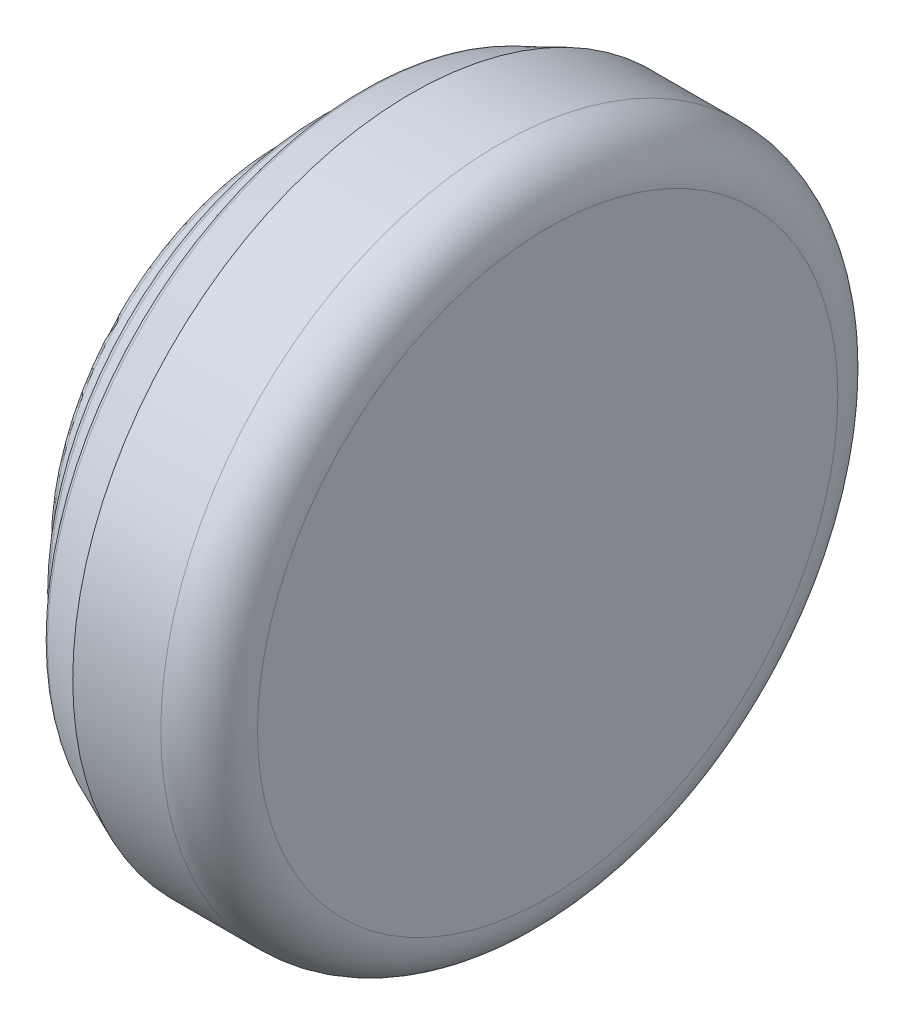
ISO-10303-21;
HEADER;
FILE_DESCRIPTION(('STEP AP214'),'2;1');
FILE_NAME('part.step','',(''),(''),'','','');
FILE_SCHEMA(('AUTOMOTIVE_DESIGN { 1 0 10303 214 1 1 1 1 }'));
ENDSEC;
DATA;
#1=APPLICATION_CONTEXT('core data for automotive mechanical design processes');
#2=APPLICATION_PROTOCOL_DEFINITION('international standard','automotive_design',2000,#1);
#3=PRODUCT_CONTEXT('',#1,'mechanical');
#4=PRODUCT('Part','Part','',(#3));
#5=PRODUCT_RELATED_PRODUCT_CATEGORY('part','',(#4));
#6=PRODUCT_DEFINITION_FORMATION('','',#4);
#7=PRODUCT_DEFINITION_CONTEXT('part definition',#1,'design');
#8=PRODUCT_DEFINITION('design','',#6,#7);
#9=PRODUCT_DEFINITION_SHAPE('','',#8);
#10=(LENGTH_UNIT() NAMED_UNIT(*) SI_UNIT(.MILLI.,.METRE.));
#11=(NAMED_UNIT(*) PLANE_ANGLE_UNIT() SI_UNIT($,.RADIAN.));
#12=(NAMED_UNIT(*) SI_UNIT($,.STERADIAN.) SOLID_ANGLE_UNIT());
#13=UNCERTAINTY_MEASURE_WITH_UNIT(LENGTH_MEASURE(1.E-05),#10,'distance_accuracy_value','');
#14=(GEOMETRIC_REPRESENTATION_CONTEXT(3) GLOBAL_UNCERTAINTY_ASSIGNED_CONTEXT((#13)) GLOBAL_UNIT_ASSIGNED_CONTEXT((#10,
#11,#12)) REPRESENTATION_CONTEXT('',''));
#15=CARTESIAN_POINT('',(0.,0.,0.));
#16=DIRECTION('',(0.,0.,1.));
#17=DIRECTION('',(1.,0.,0.));
#18=AXIS2_PLACEMENT_3D('',#15,#16,#17);
#19=CARTESIAN_POINT('',(126.445710742998,0.,0.));
#20=DIRECTION('',(1.,0.,0.));
#21=DIRECTION('',(0.,0.,-1.));
#22=AXIS2_PLACEMENT_3D('',#19,#20,#21);
#23=PLANE('',#22);
#24=CARTESIAN_POINT('',(126.445710742998,0.,0.));
#25=DIRECTION('',(-1.,0.,0.));
#26=DIRECTION('',(0.,0.,1.));
#27=AXIS2_PLACEMENT_3D('',#24,#25,#26);
#28=CIRCLE('',#27,120.);
#29=CARTESIAN_POINT('',(126.445710742998,0.,120.));
#30=VERTEX_POINT('',#29);
#31=EDGE_CURVE('E93',#30,#30,#28,.T.);
#32=ORIENTED_EDGE('',*,*,#31,.F.);
#33=EDGE_LOOP('',(#32));
#34=FACE_BOUND('',#33,.T.);
#35=ADVANCED_FACE('F49',(#34),#23,.T.);
#36=CARTESIAN_POINT('',(106.445710742998,0.,0.));
#37=DIRECTION('',(-1.,0.,0.));
#38=DIRECTION('',(0.,0.,1.));
#39=AXIS2_PLACEMENT_3D('',#36,#37,#38);
#40=TOROIDAL_SURFACE('',#39,120.,20.);
#41=ORIENTED_EDGE('',*,*,#31,.T.);
#42=EDGE_LOOP('',(#41));
#43=FACE_BOUND('',#42,.T.);
#44=CARTESIAN_POINT('',(106.445710742998,0.,0.));
#45=DIRECTION('',(-1.,0.,0.));
#46=DIRECTION('',(0.,0.,1.));
#47=AXIS2_PLACEMENT_3D('',#44,#45,#46);
#48=CIRCLE('',#47,140.);
#49=CARTESIAN_POINT('',(106.445710742998,0.,140.));
#50=VERTEX_POINT('',#49);
#51=EDGE_CURVE('E87',#50,#50,#48,.T.);
#52=ORIENTED_EDGE('',*,*,#51,.F.);
#53=EDGE_LOOP('',(#52));
#54=FACE_BOUND('',#53,.T.);
#55=ADVANCED_FACE('F97',(#43,#54),#40,.T.);
#56=CARTESIAN_POINT('',(15.,0.,0.));
#57=DIRECTION('',(1.,0.,0.));
#58=DIRECTION('',(0.,0.,-1.));
#59=AXIS2_PLACEMENT_3D('',#56,#57,#58);
#60=CONICAL_SURFACE('',#59,95.,0.402417517667305);
#61=CARTESIAN_POINT('',(18.0417805829536,0.,0.));
#62=DIRECTION('',(1.,0.,0.));
#63=DIRECTION('',(0.,0.,-1.));
#64=AXIS2_PLACEMENT_3D('',#61,#62,#63);
#65=CIRCLE('',#64,96.2947211260738);
#66=CARTESIAN_POINT('',(18.0417805829536,0.,-96.2947211260738));
#67=VERTEX_POINT('',#66);
#68=EDGE_CURVE('E78',#67,#67,#65,.T.);
#69=ORIENTED_EDGE('',*,*,#68,.T.);
#70=EDGE_LOOP('',(#69));
#71=FACE_BOUND('',#70,.T.);
#72=CARTESIAN_POINT('',(28.8270288411449,0.,0.));
#73=DIRECTION('',(1.,0.,0.));
#74=DIRECTION('',(0.,0.,-1.));
#75=AXIS2_PLACEMENT_3D('',#72,#73,#74);
#76=CIRCLE('',#75,100.88541673643);
#77=CARTESIAN_POINT('',(28.8270288411449,0.,-100.88541673643));
#78=VERTEX_POINT('',#77);
#79=EDGE_CURVE('E81',#78,#78,#76,.F.);
#80=ORIENTED_EDGE('',*,*,#79,.T.);
#81=EDGE_LOOP('',(#80));
#82=FACE_BOUND('',#81,.T.);
#83=ADVANCED_FACE('F106',(#71,#82),#60,.T.);
#84=CARTESIAN_POINT('',(15.,0.,0.));
#85=DIRECTION('',(1.,0.,0.));
#86=DIRECTION('',(0.,0.,-1.));
#87=AXIS2_PLACEMENT_3D('',#84,#85,#86);
#88=PLANE('',#87);
#89=CARTESIAN_POINT('',(15.,0.,0.));
#90=DIRECTION('',(1.,0.,0.));
#91=DIRECTION('',(0.,0.,-1.));
#92=AXIS2_PLACEMENT_3D('',#89,#90,#91);
#93=CIRCLE('',#92,91.6941367376833);
#94=CARTESIAN_POINT('',(15.,0.,-91.6941367376833));
#95=VERTEX_POINT('',#94);
#96=EDGE_CURVE('E84',#95,#95,#93,.F.);
#97=ORIENTED_EDGE('',*,*,#96,.T.);
#98=EDGE_LOOP('',(#97));
#99=FACE_BOUND('',#98,.T.);
#100=ADVANCED_FACE('F114',(#99),#88,.F.);
#101=CARTESIAN_POINT('',(31.8688094240985,0.,0.));
#102=DIRECTION('',(-1.,0.,0.));
#103=DIRECTION('',(0.,0.,1.));
#104=AXIS2_PLACEMENT_3D('',#101,#102,#103);
#105=PLANE('',#104);
#106=CARTESIAN_POINT('',(31.8688094240985,0.,0.));
#107=DIRECTION('',(-1.,0.,0.));
#108=DIRECTION('',(0.,0.,1.));
#109=AXIS2_PLACEMENT_3D('',#106,#107,#108);
#110=CIRCLE('',#109,105.48600112482);
#111=CARTESIAN_POINT('',(31.8688094240985,0.,105.48600112482));
#112=VERTEX_POINT('',#111);
#113=EDGE_CURVE('E72',#112,#112,#110,.F.);
#114=ORIENTED_EDGE('',*,*,#113,.T.);
#115=EDGE_LOOP('',(#114));
#116=FACE_BOUND('',#115,.T.);
#117=CARTESIAN_POINT('',(31.8688094240985,0.,0.));
#118=DIRECTION('',(-1.,0.,0.));
#119=DIRECTION('',(0.,0.,1.));
#120=AXIS2_PLACEMENT_3D('',#117,#118,#119);
#121=CIRCLE('',#120,110.124274600187);
#122=CARTESIAN_POINT('',(31.8688094240985,0.,110.124274600187));
#123=VERTEX_POINT('',#122);
#124=EDGE_CURVE('E75',#123,#123,#121,.T.);
#125=ORIENTED_EDGE('',*,*,#124,.T.);
#126=EDGE_LOOP('',(#125));
#127=FACE_BOUND('',#126,.T.);
#128=ADVANCED_FACE('F116',(#116,#127),#105,.T.);
#129=CARTESIAN_POINT('',(31.8688094240985,0.,0.));
#130=DIRECTION('',(1.,0.,0.));
#131=DIRECTION('',(0.,0.,-1.));
#132=AXIS2_PLACEMENT_3D('',#129,#130,#131);
#133=CONICAL_SURFACE('',#132,113.430137862503,0.402417517667305);
#134=CARTESIAN_POINT('',(34.9105900070522,0.,0.));
#135=DIRECTION('',(-1.,0.,0.));
#136=DIRECTION('',(0.,0.,1.));
#137=AXIS2_PLACEMENT_3D('',#134,#135,#136);
#138=CIRCLE('',#137,114.724858988577);
#139=CARTESIAN_POINT('',(34.9105900070522,0.,114.724858988577));
#140=VERTEX_POINT('',#139);
#141=EDGE_CURVE('E64',#140,#140,#138,.F.);
#142=ORIENTED_EDGE('',*,*,#141,.T.);
#143=EDGE_LOOP('',(#142));
#144=FACE_BOUND('',#143,.T.);
#145=CARTESIAN_POINT('',(45.6958382652435,0.,0.));
#146=DIRECTION('',(1.,0.,0.));
#147=DIRECTION('',(0.,0.,-1.));
#148=AXIS2_PLACEMENT_3D('',#145,#146,#147);
#149=CIRCLE('',#148,119.315554598933);
#150=CARTESIAN_POINT('',(45.6958382652435,0.,-119.315554598933));
#151=VERTEX_POINT('',#150);
#152=EDGE_CURVE('E69',#151,#151,#149,.F.);
#153=ORIENTED_EDGE('',*,*,#152,.T.);
#154=EDGE_LOOP('',(#153));
#155=FACE_BOUND('',#154,.T.);
#156=ADVANCED_FACE('F122',(#144,#155),#133,.T.);
#157=CARTESIAN_POINT('',(48.737618848197,0.,0.));
#158=DIRECTION('',(-1.,0.,0.));
#159=DIRECTION('',(0.,0.,1.));
#160=AXIS2_PLACEMENT_3D('',#157,#158,#159);
#161=PLANE('',#160);
#162=CARTESIAN_POINT('',(48.737618848197,0.,0.));
#163=DIRECTION('',(-1.,0.,0.));
#164=DIRECTION('',(0.,0.,1.));
#165=AXIS2_PLACEMENT_3D('',#162,#163,#164);
#166=CIRCLE('',#165,123.916138987324);
#167=CARTESIAN_POINT('',(48.737618848197,0.,123.916138987324));
#168=VERTEX_POINT('',#167);
#169=EDGE_CURVE('E56',#168,#168,#166,.F.);
#170=ORIENTED_EDGE('',*,*,#169,.T.);
#171=EDGE_LOOP('',(#170));
#172=FACE_BOUND('',#171,.T.);
#173=CARTESIAN_POINT('',(48.737618848197,0.,0.));
#174=DIRECTION('',(-1.,0.,0.));
#175=DIRECTION('',(0.,0.,1.));
#176=AXIS2_PLACEMENT_3D('',#173,#174,#175);
#177=CIRCLE('',#176,127.626890523058);
#178=CARTESIAN_POINT('',(48.737618848197,0.,127.626890523058));
#179=VERTEX_POINT('',#178);
#180=EDGE_CURVE('E60',#179,#179,#177,.T.);
#181=ORIENTED_EDGE('',*,*,#180,.T.);
#182=EDGE_LOOP('',(#181));
#183=FACE_BOUND('',#182,.T.);
#184=ADVANCED_FACE('F130',(#172,#183),#161,.T.);
#185=CARTESIAN_POINT('',(48.7376188481971,0.,0.));
#186=DIRECTION('',(1.,0.,0.));
#187=DIRECTION('',(0.,0.,-1.));
#188=AXIS2_PLACEMENT_3D('',#185,#186,#187);
#189=CONICAL_SURFACE('',#188,130.932753785375,0.402417517667306);
#190=CARTESIAN_POINT('',(51.7793994311506,0.,0.));
#191=DIRECTION('',(-1.,0.,0.));
#192=DIRECTION('',(0.,0.,1.));
#193=AXIS2_PLACEMENT_3D('',#190,#191,#192);
#194=CIRCLE('',#193,132.227474911449);
#195=CARTESIAN_POINT('',(51.7793994311506,0.,132.227474911449));
#196=VERTEX_POINT('',#195);
#197=EDGE_CURVE('E10',#196,#196,#194,.F.);
#198=ORIENTED_EDGE('',*,*,#197,.T.);
#199=EDGE_LOOP('',(#198));
#200=FACE_BOUND('',#199,.T.);
#201=CARTESIAN_POINT('',(70.0399463696018,0.,0.));
#202=DIRECTION('',(-1.,0.,0.));
#203=DIRECTION('',(0.,0.,1.));
#204=AXIS2_PLACEMENT_3D('',#201,#202,#203);
#205=CIRCLE('',#204,140.);
#206=CARTESIAN_POINT('',(70.0399463696018,0.,140.));
#207=VERTEX_POINT('',#206);
#208=EDGE_CURVE('E90',#207,#207,#205,.T.);
#209=ORIENTED_EDGE('',*,*,#208,.T.);
#210=EDGE_LOOP('',(#209));
#211=FACE_BOUND('',#210,.T.);
#212=ADVANCED_FACE('F134',(#200,#211),#189,.T.);
#213=CARTESIAN_POINT('',(-209.218950064021,0.,0.));
#214=DIRECTION('',(-1.,0.,0.));
#215=DIRECTION('',(0.,0.,1.));
#216=AXIS2_PLACEMENT_3D('',#213,#214,#215);
#217=CYLINDRICAL_SURFACE('',#216,140.);
#218=ORIENTED_EDGE('',*,*,#51,.T.);
#219=EDGE_LOOP('',(#218));
#220=FACE_BOUND('',#219,.T.);
#221=ORIENTED_EDGE('',*,*,#208,.F.);
#222=EDGE_LOOP('',(#221));
#223=FACE_BOUND('',#222,.T.);
#224=ADVANCED_FACE('F108',(#220,#223),#217,.T.);
#225=CARTESIAN_POINT('',(20.,0.,0.));
#226=DIRECTION('',(1.,0.,0.));
#227=DIRECTION('',(0.,0.,-1.));
#228=AXIS2_PLACEMENT_3D('',#225,#226,#227);
#229=TOROIDAL_SURFACE('',#228,91.6941367376833,5.);
#230=ORIENTED_EDGE('',*,*,#68,.F.);
#231=EDGE_LOOP('',(#230));
#232=FACE_BOUND('',#231,.T.);
#233=ORIENTED_EDGE('',*,*,#96,.F.);
#234=EDGE_LOOP('',(#233));
#235=FACE_BOUND('',#234,.T.);
#236=ADVANCED_FACE('F102',(#232,#235),#229,.T.);
#237=CARTESIAN_POINT('',(26.8688094240985,0.,0.));
#238=DIRECTION('',(-1.,0.,0.));
#239=DIRECTION('',(0.,0.,1.));
#240=AXIS2_PLACEMENT_3D('',#237,#238,#239);
#241=TOROIDAL_SURFACE('',#240,105.48600112482,5.);
#242=ORIENTED_EDGE('',*,*,#113,.F.);
#243=EDGE_LOOP('',(#242));
#244=FACE_BOUND('',#243,.T.);
#245=ORIENTED_EDGE('',*,*,#79,.F.);
#246=EDGE_LOOP('',(#245));
#247=FACE_BOUND('',#246,.T.);
#248=ADVANCED_FACE('F111',(#244,#247),#241,.F.);
#249=CARTESIAN_POINT('',(36.8688094240985,0.,0.));
#250=DIRECTION('',(-1.,0.,0.));
#251=DIRECTION('',(0.,0.,1.));
#252=AXIS2_PLACEMENT_3D('',#249,#250,#251);
#253=TOROIDAL_SURFACE('',#252,110.124274600187,5.);
#254=ORIENTED_EDGE('',*,*,#141,.F.);
#255=EDGE_LOOP('',(#254));
#256=FACE_BOUND('',#255,.T.);
#257=ORIENTED_EDGE('',*,*,#124,.F.);
#258=EDGE_LOOP('',(#257));
#259=FACE_BOUND('',#258,.T.);
#260=ADVANCED_FACE('F142',(#256,#259),#253,.T.);
#261=CARTESIAN_POINT('',(43.737618848197,0.,0.));
#262=DIRECTION('',(-1.,0.,0.));
#263=DIRECTION('',(0.,0.,1.));
#264=AXIS2_PLACEMENT_3D('',#261,#262,#263);
#265=TOROIDAL_SURFACE('',#264,123.916138987324,5.);
#266=ORIENTED_EDGE('',*,*,#169,.F.);
#267=EDGE_LOOP('',(#266));
#268=FACE_BOUND('',#267,.T.);
#269=ORIENTED_EDGE('',*,*,#152,.F.);
#270=EDGE_LOOP('',(#269));
#271=FACE_BOUND('',#270,.T.);
#272=ADVANCED_FACE('F145',(#268,#271),#265,.F.);
#273=CARTESIAN_POINT('',(53.737618848197,0.,0.));
#274=DIRECTION('',(-1.,0.,0.));
#275=DIRECTION('',(0.,0.,1.));
#276=AXIS2_PLACEMENT_3D('',#273,#274,#275);
#277=TOROIDAL_SURFACE('',#276,127.626890523058,5.);
#278=ORIENTED_EDGE('',*,*,#197,.F.);
#279=EDGE_LOOP('',(#278));
#280=FACE_BOUND('',#279,.T.);
#281=ORIENTED_EDGE('',*,*,#180,.F.);
#282=EDGE_LOOP('',(#281));
#283=FACE_BOUND('',#282,.T.);
#284=ADVANCED_FACE('F51',(#280,#283),#277,.T.);
#285=CLOSED_SHELL('',(#35,#55,#83,#100,#128,#156,#184,#212,#224,#236,#248,#260,#272,#284));
#286=MANIFOLD_SOLID_BREP('B2',#285);
#287=ADVANCED_BREP_SHAPE_REPRESENTATION('',(#18,#286),#14);
#288=SHAPE_DEFINITION_REPRESENTATION(#9,#287);
ENDSEC;
END-ISO-10303-21;
